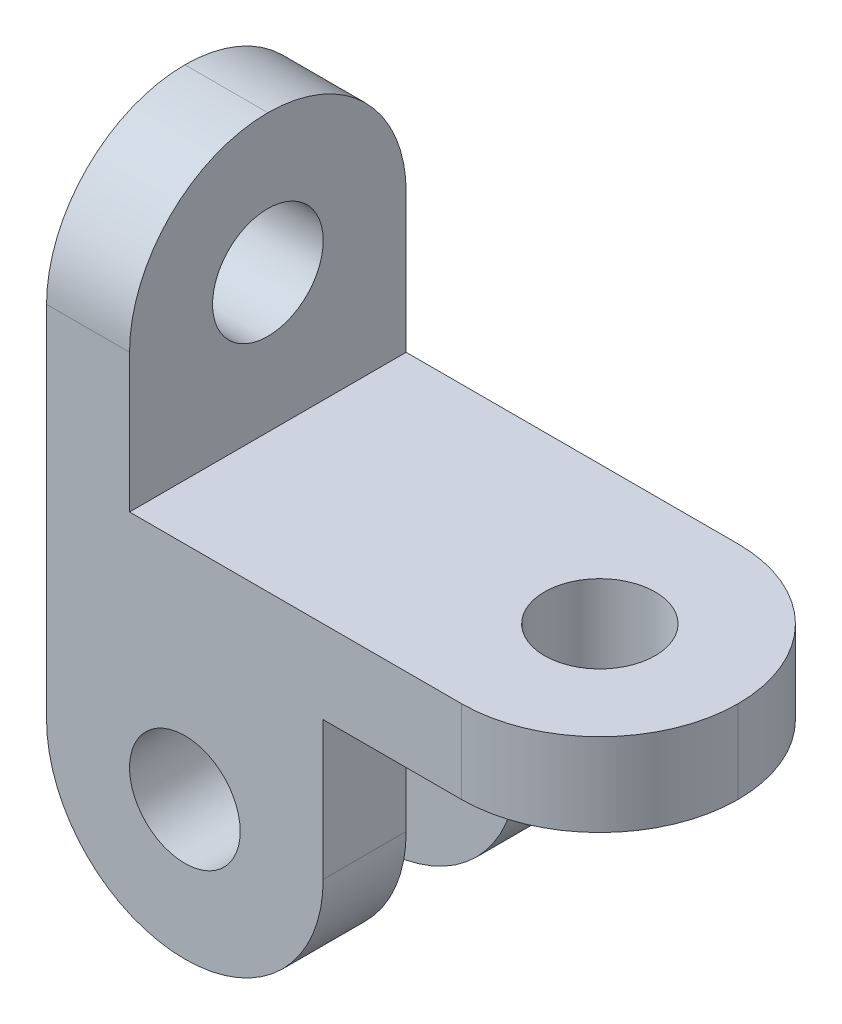
ISO-10303-21;
HEADER;
FILE_DESCRIPTION(('STEP AP214'),'2;1');
FILE_NAME('part.step','',(''),(''),'','','');
FILE_SCHEMA(('AUTOMOTIVE_DESIGN { 1 0 10303 214 1 1 1 1 }'));
ENDSEC;
DATA;
#1=APPLICATION_CONTEXT('core data for automotive mechanical design processes');
#2=APPLICATION_PROTOCOL_DEFINITION('international standard','automotive_design',2000,#1);
#3=PRODUCT_CONTEXT('',#1,'mechanical');
#4=PRODUCT('Part','Part','',(#3));
#5=PRODUCT_RELATED_PRODUCT_CATEGORY('part','',(#4));
#6=PRODUCT_DEFINITION_FORMATION('','',#4);
#7=PRODUCT_DEFINITION_CONTEXT('part definition',#1,'design');
#8=PRODUCT_DEFINITION('design','',#6,#7);
#9=PRODUCT_DEFINITION_SHAPE('','',#8);
#10=(LENGTH_UNIT() NAMED_UNIT(*) SI_UNIT(.MILLI.,.METRE.));
#11=(NAMED_UNIT(*) PLANE_ANGLE_UNIT() SI_UNIT($,.RADIAN.));
#12=(NAMED_UNIT(*) SI_UNIT($,.STERADIAN.) SOLID_ANGLE_UNIT());
#13=UNCERTAINTY_MEASURE_WITH_UNIT(LENGTH_MEASURE(1.E-05),#10,'distance_accuracy_value','');
#14=(GEOMETRIC_REPRESENTATION_CONTEXT(3) GLOBAL_UNCERTAINTY_ASSIGNED_CONTEXT((#13)) GLOBAL_UNIT_ASSIGNED_CONTEXT((#10,
#11,#12)) REPRESENTATION_CONTEXT('',''));
#15=CARTESIAN_POINT('',(0.,0.,0.));
#16=DIRECTION('',(0.,0.,1.));
#17=DIRECTION('',(1.,0.,0.));
#18=AXIS2_PLACEMENT_3D('',#15,#16,#17);
#19=CARTESIAN_POINT('',(0.,0.,0.));
#20=DIRECTION('',(0.,1.,0.));
#21=DIRECTION('',(0.,0.,1.));
#22=AXIS2_PLACEMENT_3D('',#19,#20,#21);
#23=PLANE('',#22);
#24=CARTESIAN_POINT('',(25.7142857142857,0.,3.31428571428571));
#25=DIRECTION('',(0.,1.,0.));
#26=DIRECTION('',(0.,0.,1.));
#27=AXIS2_PLACEMENT_3D('',#24,#25,#26);
#28=CIRCLE('',#27,8.);
#29=CARTESIAN_POINT('',(25.7142857142857,0.,11.3142857142857));
#30=VERTEX_POINT('',#29);
#31=EDGE_CURVE('E284',#30,#30,#28,.T.);
#32=ORIENTED_EDGE('',*,*,#31,.T.);
#33=EDGE_LOOP('',(#32));
#34=FACE_BOUND('',#33,.T.);
#35=DIRECTION('',(-1.,0.,0.));
#36=VECTOR('',#35,1.);
#37=CARTESIAN_POINT('',(-34.2857142857143,0.,-16.6857142857143));
#38=LINE('',#37,#36);
#39=CARTESIAN_POINT('',(25.7142857142857,0.,-16.6857142857143));
#40=VERTEX_POINT('',#39);
#41=CARTESIAN_POINT('',(5.71428571428571,0.,-16.6857142857143));
#42=VERTEX_POINT('',#41);
#43=EDGE_CURVE('E167',#40,#42,#38,.T.);
#44=ORIENTED_EDGE('',*,*,#43,.F.);
#45=CARTESIAN_POINT('',(25.7142857142857,0.,3.31428571428571));
#46=DIRECTION('',(0.,1.,0.));
#47=DIRECTION('',(0.,0.,1.));
#48=AXIS2_PLACEMENT_3D('',#45,#46,#47);
#49=CIRCLE('',#48,20.);
#50=CARTESIAN_POINT('',(45.7142857142857,0.,3.31428571428571));
#51=VERTEX_POINT('',#50);
#52=EDGE_CURVE('E264',#40,#51,#49,.F.);
#53=ORIENTED_EDGE('',*,*,#52,.T.);
#54=CARTESIAN_POINT('',(25.7142857142857,0.,3.31428571428571));
#55=DIRECTION('',(0.,1.,0.));
#56=DIRECTION('',(0.,0.,1.));
#57=AXIS2_PLACEMENT_3D('',#54,#55,#56);
#58=CIRCLE('',#57,20.);
#59=CARTESIAN_POINT('',(25.7142857142857,0.,23.3142857142857));
#60=VERTEX_POINT('',#59);
#61=EDGE_CURVE('E262',#51,#60,#58,.F.);
#62=ORIENTED_EDGE('',*,*,#61,.T.);
#63=DIRECTION('',(1.,0.,0.));
#64=VECTOR('',#63,1.);
#65=CARTESIAN_POINT('',(-34.2857142857143,0.,23.3142857142857));
#66=LINE('',#65,#64);
#67=CARTESIAN_POINT('',(5.71428571428572,0.,23.3142857142857));
#68=VERTEX_POINT('',#67);
#69=EDGE_CURVE('E174',#68,#60,#66,.T.);
#70=ORIENTED_EDGE('',*,*,#69,.F.);
#71=DIRECTION('',(0.,0.,1.));
#72=VECTOR('',#71,1.);
#73=CARTESIAN_POINT('',(5.71428571428572,0.,23.3142857142857));
#74=LINE('',#73,#72);
#75=CARTESIAN_POINT('',(5.71428571428572,0.,11.3142857142857));
#76=VERTEX_POINT('',#75);
#77=EDGE_CURVE('E194',#76,#68,#74,.T.);
#78=ORIENTED_EDGE('',*,*,#77,.F.);
#79=DIRECTION('',(1.,0.,0.));
#80=VECTOR('',#79,1.);
#81=CARTESIAN_POINT('',(-34.2857142857143,0.,11.3142857142857));
#82=LINE('',#81,#80);
#83=CARTESIAN_POINT('',(-34.2857142857143,0.,11.3142857142857));
#84=VERTEX_POINT('',#83);
#85=EDGE_CURVE('E162',#84,#76,#82,.T.);
#86=ORIENTED_EDGE('',*,*,#85,.F.);
#87=DIRECTION('',(0.,0.,1.));
#88=VECTOR('',#87,1.);
#89=CARTESIAN_POINT('',(-34.2857142857143,0.,-16.6857142857143));
#90=LINE('',#89,#88);
#91=CARTESIAN_POINT('',(-34.2857142857143,0.,-4.68571428571429));
#92=VERTEX_POINT('',#91);
#93=EDGE_CURVE('E211',#92,#84,#90,.T.);
#94=ORIENTED_EDGE('',*,*,#93,.F.);
#95=DIRECTION('',(-1.,0.,0.));
#96=VECTOR('',#95,1.);
#97=CARTESIAN_POINT('',(-34.2857142857143,0.,-4.68571428571429));
#98=LINE('',#97,#96);
#99=CARTESIAN_POINT('',(5.71428571428571,0.,-4.68571428571429));
#100=VERTEX_POINT('',#99);
#101=EDGE_CURVE('E178',#100,#92,#98,.T.);
#102=ORIENTED_EDGE('',*,*,#101,.F.);
#103=DIRECTION('',(0.,0.,1.));
#104=VECTOR('',#103,1.);
#105=CARTESIAN_POINT('',(5.71428571428571,0.,-16.6857142857143));
#106=LINE('',#105,#104);
#107=EDGE_CURVE('E156',#42,#100,#106,.T.);
#108=ORIENTED_EDGE('',*,*,#107,.F.);
#109=EDGE_LOOP('',(#44,#53,#62,#70,#78,#86,#94,#102,#108));
#110=FACE_BOUND('',#109,.T.);
#111=ADVANCED_FACE('F37',(#34,#110),#23,.F.);
#112=CARTESIAN_POINT('',(-34.2857142857143,12.,-16.6857142857143));
#113=DIRECTION('',(1.,0.,0.));
#114=DIRECTION('',(0.,0.,-1.));
#115=AXIS2_PLACEMENT_3D('',#112,#113,#114);
#116=PLANE('',#115);
#117=CARTESIAN_POINT('',(-34.2857142857143,32.,3.31428571428572));
#118=DIRECTION('',(1.,0.,0.));
#119=DIRECTION('',(0.,0.,-1.));
#120=AXIS2_PLACEMENT_3D('',#117,#118,#119);
#121=CIRCLE('',#120,8.);
#122=CARTESIAN_POINT('',(-34.2857142857143,32.,-4.68571428571429));
#123=VERTEX_POINT('',#122);
#124=EDGE_CURVE('E276',#123,#123,#121,.T.);
#125=ORIENTED_EDGE('',*,*,#124,.T.);
#126=EDGE_LOOP('',(#125));
#127=FACE_BOUND('',#126,.T.);
#128=DIRECTION('',(0.,-1.,0.));
#129=VECTOR('',#128,1.);
#130=CARTESIAN_POINT('',(-34.2857142857143,12.,-16.6857142857143));
#131=LINE('',#130,#129);
#132=CARTESIAN_POINT('',(-34.2857142857143,32.,-16.6857142857143));
#133=VERTEX_POINT('',#132);
#134=CARTESIAN_POINT('',(-34.2857142857143,-20.,-16.6857142857143));
#135=VERTEX_POINT('',#134);
#136=EDGE_CURVE('E215',#133,#135,#131,.T.);
#137=ORIENTED_EDGE('',*,*,#136,.T.);
#138=DIRECTION('',(0.,0.,-1.));
#139=VECTOR('',#138,1.);
#140=CARTESIAN_POINT('',(-34.2857142857143,-20.,-16.6857142857143));
#141=LINE('',#140,#139);
#142=CARTESIAN_POINT('',(-34.2857142857143,-20.,-4.68571428571429));
#143=VERTEX_POINT('',#142);
#144=EDGE_CURVE('E240',#135,#143,#141,.F.);
#145=ORIENTED_EDGE('',*,*,#144,.T.);
#146=DIRECTION('',(0.,1.,0.));
#147=VECTOR('',#146,1.);
#148=CARTESIAN_POINT('',(-34.2857142857143,-40.,-4.68571428571429));
#149=LINE('',#148,#147);
#150=EDGE_CURVE('E181',#143,#92,#149,.T.);
#151=ORIENTED_EDGE('',*,*,#150,.T.);
#152=ORIENTED_EDGE('',*,*,#93,.T.);
#153=DIRECTION('',(0.,1.,0.));
#154=VECTOR('',#153,1.);
#155=CARTESIAN_POINT('',(-34.2857142857143,-40.,11.3142857142857));
#156=LINE('',#155,#154);
#157=CARTESIAN_POINT('',(-34.2857142857143,-20.,11.3142857142857));
#158=VERTEX_POINT('',#157);
#159=EDGE_CURVE('E201',#158,#84,#156,.T.);
#160=ORIENTED_EDGE('',*,*,#159,.F.);
#161=DIRECTION('',(0.,0.,-1.));
#162=VECTOR('',#161,1.);
#163=CARTESIAN_POINT('',(-34.2857142857143,-20.,23.3142857142857));
#164=LINE('',#163,#162);
#165=CARTESIAN_POINT('',(-34.2857142857143,-20.,23.3142857142857));
#166=VERTEX_POINT('',#165);
#167=EDGE_CURVE('E237',#158,#166,#164,.F.);
#168=ORIENTED_EDGE('',*,*,#167,.T.);
#169=DIRECTION('',(0.,-1.,0.));
#170=VECTOR('',#169,1.);
#171=CARTESIAN_POINT('',(-34.2857142857143,12.,23.3142857142857));
#172=LINE('',#171,#170);
#173=CARTESIAN_POINT('',(-34.2857142857143,32.,23.3142857142857));
#174=VERTEX_POINT('',#173);
#175=EDGE_CURVE('E222',#174,#166,#172,.T.);
#176=ORIENTED_EDGE('',*,*,#175,.F.);
#177=CARTESIAN_POINT('',(-34.2857142857143,32.,3.31428571428571));
#178=DIRECTION('',(1.,0.,0.));
#179=DIRECTION('',(0.,0.,-1.));
#180=AXIS2_PLACEMENT_3D('',#177,#178,#179);
#181=CIRCLE('',#180,20.);
#182=CARTESIAN_POINT('',(-34.2857142857143,52.,3.31428571428571));
#183=VERTEX_POINT('',#182);
#184=EDGE_CURVE('E233',#174,#183,#181,.F.);
#185=ORIENTED_EDGE('',*,*,#184,.T.);
#186=CARTESIAN_POINT('',(-34.2857142857143,32.,3.31428571428571));
#187=DIRECTION('',(1.,0.,0.));
#188=DIRECTION('',(0.,0.,-1.));
#189=AXIS2_PLACEMENT_3D('',#186,#187,#188);
#190=CIRCLE('',#189,20.);
#191=EDGE_CURVE('E235',#183,#133,#190,.F.);
#192=ORIENTED_EDGE('',*,*,#191,.T.);
#193=EDGE_LOOP('',(#137,#145,#151,#152,#160,#168,#176,#185,#192));
#194=FACE_BOUND('',#193,.T.);
#195=ADVANCED_FACE('F322',(#127,#194),#116,.F.);
#196=CARTESIAN_POINT('',(-34.2857142857143,12.,23.3142857142857));
#197=DIRECTION('',(0.,0.,-1.));
#198=DIRECTION('',(-1.,0.,0.));
#199=AXIS2_PLACEMENT_3D('',#196,#197,#198);
#200=PLANE('',#199);
#201=CARTESIAN_POINT('',(-14.2857142857143,-20.,23.3142857142857));
#202=DIRECTION('',(0.,0.,1.));
#203=DIRECTION('',(1.,0.,0.));
#204=AXIS2_PLACEMENT_3D('',#201,#202,#203);
#205=CIRCLE('',#204,8.);
#206=CARTESIAN_POINT('',(-6.28571428571428,-20.,23.3142857142857));
#207=VERTEX_POINT('',#206);
#208=EDGE_CURVE('E294',#207,#207,#205,.T.);
#209=ORIENTED_EDGE('',*,*,#208,.F.);
#210=EDGE_LOOP('',(#209));
#211=FACE_BOUND('',#210,.T.);
#212=ORIENTED_EDGE('',*,*,#175,.T.);
#213=CARTESIAN_POINT('',(-14.2857142857143,-20.,23.3142857142857));
#214=DIRECTION('',(0.,0.,-1.));
#215=DIRECTION('',(-1.,0.,0.));
#216=AXIS2_PLACEMENT_3D('',#213,#214,#215);
#217=CIRCLE('',#216,20.);
#218=CARTESIAN_POINT('',(-14.2857142857143,-40.,23.3142857142857));
#219=VERTEX_POINT('',#218);
#220=EDGE_CURVE('E257',#166,#219,#217,.F.);
#221=ORIENTED_EDGE('',*,*,#220,.T.);
#222=CARTESIAN_POINT('',(-14.2857142857143,-20.,23.3142857142857));
#223=DIRECTION('',(0.,0.,-1.));
#224=DIRECTION('',(-1.,0.,0.));
#225=AXIS2_PLACEMENT_3D('',#222,#223,#224);
#226=CIRCLE('',#225,20.);
#227=CARTESIAN_POINT('',(5.71428571428572,-20.,23.3142857142857));
#228=VERTEX_POINT('',#227);
#229=EDGE_CURVE('E255',#219,#228,#226,.F.);
#230=ORIENTED_EDGE('',*,*,#229,.T.);
#231=DIRECTION('',(0.,1.,0.));
#232=VECTOR('',#231,1.);
#233=CARTESIAN_POINT('',(5.71428571428572,-40.,23.3142857142857));
#234=LINE('',#233,#232);
#235=EDGE_CURVE('E197',#228,#68,#234,.T.);
#236=ORIENTED_EDGE('',*,*,#235,.T.);
#237=ORIENTED_EDGE('',*,*,#69,.T.);
#238=DIRECTION('',(0.,-1.,0.));
#239=VECTOR('',#238,1.);
#240=CARTESIAN_POINT('',(25.7142857142857,12.,23.3142857142857));
#241=LINE('',#240,#239);
#242=CARTESIAN_POINT('',(25.7142857142857,12.,23.3142857142857));
#243=VERTEX_POINT('',#242);
#244=EDGE_CURVE('E253',#60,#243,#241,.F.);
#245=ORIENTED_EDGE('',*,*,#244,.T.);
#246=DIRECTION('',(1.,0.,0.));
#247=VECTOR('',#246,1.);
#248=CARTESIAN_POINT('',(-34.2857142857143,12.,23.3142857142857));
#249=LINE('',#248,#247);
#250=CARTESIAN_POINT('',(-22.2857142857143,12.,23.3142857142857));
#251=VERTEX_POINT('',#250);
#252=EDGE_CURVE('E173',#251,#243,#249,.T.);
#253=ORIENTED_EDGE('',*,*,#252,.F.);
#254=DIRECTION('',(0.,-1.,0.));
#255=VECTOR('',#254,1.);
#256=CARTESIAN_POINT('',(-22.2857142857143,52.,23.3142857142857));
#257=LINE('',#256,#255);
#258=CARTESIAN_POINT('',(-22.2857142857143,32.,23.3142857142857));
#259=VERTEX_POINT('',#258);
#260=EDGE_CURVE('E209',#259,#251,#257,.T.);
#261=ORIENTED_EDGE('',*,*,#260,.F.);
#262=DIRECTION('',(1.,0.,0.));
#263=VECTOR('',#262,1.);
#264=CARTESIAN_POINT('',(-34.2857142857143,32.,23.3142857142857));
#265=LINE('',#264,#263);
#266=EDGE_CURVE('E251',#259,#174,#265,.F.);
#267=ORIENTED_EDGE('',*,*,#266,.T.);
#268=EDGE_LOOP('',(#212,#221,#230,#236,#237,#245,#253,#261,#267));
#269=FACE_BOUND('',#268,.T.);
#270=ADVANCED_FACE('F328',(#211,#269),#200,.F.);
#271=CARTESIAN_POINT('',(-34.2857142857143,12.,-16.6857142857143));
#272=DIRECTION('',(0.,0.,1.));
#273=DIRECTION('',(1.,0.,0.));
#274=AXIS2_PLACEMENT_3D('',#271,#272,#273);
#275=PLANE('',#274);
#276=CARTESIAN_POINT('',(-14.2857142857143,-20.,-16.6857142857143));
#277=DIRECTION('',(0.,0.,1.));
#278=DIRECTION('',(1.,0.,0.));
#279=AXIS2_PLACEMENT_3D('',#276,#277,#278);
#280=CIRCLE('',#279,8.);
#281=CARTESIAN_POINT('',(-6.28571428571428,-20.,-16.6857142857143));
#282=VERTEX_POINT('',#281);
#283=EDGE_CURVE('E297',#282,#282,#280,.T.);
#284=ORIENTED_EDGE('',*,*,#283,.T.);
#285=EDGE_LOOP('',(#284));
#286=FACE_BOUND('',#285,.T.);
#287=CARTESIAN_POINT('',(-14.2857142857143,-20.,-16.6857142857143));
#288=DIRECTION('',(0.,0.,1.));
#289=DIRECTION('',(1.,0.,0.));
#290=AXIS2_PLACEMENT_3D('',#287,#288,#289);
#291=CIRCLE('',#290,20.);
#292=CARTESIAN_POINT('',(5.71428571428571,-20.,-16.6857142857143));
#293=VERTEX_POINT('',#292);
#294=CARTESIAN_POINT('',(-14.2857142857143,-40.,-16.6857142857143));
#295=VERTEX_POINT('',#294);
#296=EDGE_CURVE('E229',#293,#295,#291,.F.);
#297=ORIENTED_EDGE('',*,*,#296,.T.);
#298=CARTESIAN_POINT('',(-14.2857142857143,-20.,-16.6857142857143));
#299=DIRECTION('',(0.,0.,1.));
#300=DIRECTION('',(1.,0.,0.));
#301=AXIS2_PLACEMENT_3D('',#298,#299,#300);
#302=CIRCLE('',#301,20.);
#303=EDGE_CURVE('E231',#295,#135,#302,.F.);
#304=ORIENTED_EDGE('',*,*,#303,.T.);
#305=ORIENTED_EDGE('',*,*,#136,.F.);
#306=DIRECTION('',(-1.,0.,0.));
#307=VECTOR('',#306,1.);
#308=CARTESIAN_POINT('',(-22.2857142857143,32.,-16.6857142857143));
#309=LINE('',#308,#307);
#310=CARTESIAN_POINT('',(-22.2857142857143,32.,-16.6857142857143));
#311=VERTEX_POINT('',#310);
#312=EDGE_CURVE('E225',#133,#311,#309,.F.);
#313=ORIENTED_EDGE('',*,*,#312,.T.);
#314=DIRECTION('',(0.,-1.,0.));
#315=VECTOR('',#314,1.);
#316=CARTESIAN_POINT('',(-22.2857142857143,52.,-16.6857142857143));
#317=LINE('',#316,#315);
#318=CARTESIAN_POINT('',(-22.2857142857143,12.,-16.6857142857143));
#319=VERTEX_POINT('',#318);
#320=EDGE_CURVE('E206',#311,#319,#317,.T.);
#321=ORIENTED_EDGE('',*,*,#320,.T.);
#322=DIRECTION('',(-1.,0.,0.));
#323=VECTOR('',#322,1.);
#324=CARTESIAN_POINT('',(-34.2857142857143,12.,-16.6857142857143));
#325=LINE('',#324,#323);
#326=CARTESIAN_POINT('',(25.7142857142857,12.,-16.6857142857143));
#327=VERTEX_POINT('',#326);
#328=EDGE_CURVE('E213',#327,#319,#325,.T.);
#329=ORIENTED_EDGE('',*,*,#328,.F.);
#330=DIRECTION('',(0.,-1.,0.));
#331=VECTOR('',#330,1.);
#332=CARTESIAN_POINT('',(25.7142857142857,12.,-16.6857142857143));
#333=LINE('',#332,#331);
#334=EDGE_CURVE('E171',#327,#40,#333,.T.);
#335=ORIENTED_EDGE('',*,*,#334,.T.);
#336=ORIENTED_EDGE('',*,*,#43,.T.);
#337=DIRECTION('',(0.,1.,0.));
#338=VECTOR('',#337,1.);
#339=CARTESIAN_POINT('',(5.71428571428571,-40.,-16.6857142857143));
#340=LINE('',#339,#338);
#341=EDGE_CURVE('E151',#293,#42,#340,.T.);
#342=ORIENTED_EDGE('',*,*,#341,.F.);
#343=EDGE_LOOP('',(#297,#304,#305,#313,#321,#329,#335,#336,#342));
#344=FACE_BOUND('',#343,.T.);
#345=ADVANCED_FACE('F168',(#286,#344),#275,.F.);
#346=CARTESIAN_POINT('',(0.,12.,0.));
#347=DIRECTION('',(0.,1.,0.));
#348=DIRECTION('',(0.,0.,1.));
#349=AXIS2_PLACEMENT_3D('',#346,#347,#348);
#350=PLANE('',#349);
#351=CARTESIAN_POINT('',(25.7142857142857,12.,3.31428571428571));
#352=DIRECTION('',(0.,1.,0.));
#353=DIRECTION('',(0.,0.,1.));
#354=AXIS2_PLACEMENT_3D('',#351,#352,#353);
#355=CIRCLE('',#354,8.);
#356=CARTESIAN_POINT('',(25.7142857142857,12.,11.3142857142857));
#357=VERTEX_POINT('',#356);
#358=EDGE_CURVE('E286',#357,#357,#355,.T.);
#359=ORIENTED_EDGE('',*,*,#358,.F.);
#360=EDGE_LOOP('',(#359));
#361=FACE_BOUND('',#360,.T.);
#362=CARTESIAN_POINT('',(25.7142857142857,12.,3.31428571428571));
#363=DIRECTION('',(0.,1.,0.));
#364=DIRECTION('',(0.,0.,1.));
#365=AXIS2_PLACEMENT_3D('',#362,#363,#364);
#366=CIRCLE('',#365,20.);
#367=CARTESIAN_POINT('',(45.7142857142857,12.,3.31428571428571));
#368=VERTEX_POINT('',#367);
#369=EDGE_CURVE('E60',#243,#368,#366,.T.);
#370=ORIENTED_EDGE('',*,*,#369,.T.);
#371=CARTESIAN_POINT('',(25.7142857142857,12.,3.31428571428571));
#372=DIRECTION('',(0.,1.,0.));
#373=DIRECTION('',(0.,0.,1.));
#374=AXIS2_PLACEMENT_3D('',#371,#372,#373);
#375=CIRCLE('',#374,20.);
#376=EDGE_CURVE('E267',#368,#327,#375,.T.);
#377=ORIENTED_EDGE('',*,*,#376,.T.);
#378=ORIENTED_EDGE('',*,*,#328,.T.);
#379=DIRECTION('',(0.,0.,-1.));
#380=VECTOR('',#379,1.);
#381=CARTESIAN_POINT('',(-22.2857142857143,12.,-16.6857142857143));
#382=LINE('',#381,#380);
#383=EDGE_CURVE('E203',#251,#319,#382,.T.);
#384=ORIENTED_EDGE('',*,*,#383,.F.);
#385=ORIENTED_EDGE('',*,*,#252,.T.);
#386=EDGE_LOOP('',(#370,#377,#378,#384,#385));
#387=FACE_BOUND('',#386,.T.);
#388=ADVANCED_FACE('F332',(#361,#387),#350,.T.);
#389=CARTESIAN_POINT('',(-22.2857142857143,52.,-16.6857142857143));
#390=DIRECTION('',(-1.,0.,0.));
#391=DIRECTION('',(0.,0.,1.));
#392=AXIS2_PLACEMENT_3D('',#389,#390,#391);
#393=PLANE('',#392);
#394=CARTESIAN_POINT('',(-22.2857142857143,32.,3.31428571428571));
#395=DIRECTION('',(1.,0.,0.));
#396=DIRECTION('',(0.,0.,-1.));
#397=AXIS2_PLACEMENT_3D('',#394,#395,#396);
#398=CIRCLE('',#397,8.);
#399=CARTESIAN_POINT('',(-22.2857142857143,32.,-4.68571428571429));
#400=VERTEX_POINT('',#399);
#401=EDGE_CURVE('E187',#400,#400,#398,.T.);
#402=ORIENTED_EDGE('',*,*,#401,.F.);
#403=EDGE_LOOP('',(#402));
#404=FACE_BOUND('',#403,.T.);
#405=ORIENTED_EDGE('',*,*,#320,.F.);
#406=CARTESIAN_POINT('',(-22.2857142857143,32.,3.31428571428571));
#407=DIRECTION('',(-1.,0.,0.));
#408=DIRECTION('',(0.,0.,1.));
#409=AXIS2_PLACEMENT_3D('',#406,#407,#408);
#410=CIRCLE('',#409,20.);
#411=CARTESIAN_POINT('',(-22.2857142857143,52.,3.31428571428571));
#412=VERTEX_POINT('',#411);
#413=EDGE_CURVE('E11',#311,#412,#410,.F.);
#414=ORIENTED_EDGE('',*,*,#413,.T.);
#415=CARTESIAN_POINT('',(-22.2857142857143,32.,3.31428571428571));
#416=DIRECTION('',(-1.,0.,0.));
#417=DIRECTION('',(0.,0.,1.));
#418=AXIS2_PLACEMENT_3D('',#415,#416,#417);
#419=CIRCLE('',#418,20.);
#420=EDGE_CURVE('E46',#412,#259,#419,.F.);
#421=ORIENTED_EDGE('',*,*,#420,.T.);
#422=ORIENTED_EDGE('',*,*,#260,.T.);
#423=ORIENTED_EDGE('',*,*,#383,.T.);
#424=EDGE_LOOP('',(#405,#414,#421,#422,#423));
#425=FACE_BOUND('',#424,.T.);
#426=ADVANCED_FACE('F373',(#404,#425),#393,.F.);
#427=CARTESIAN_POINT('',(-34.2857142857143,-40.,11.3142857142857));
#428=DIRECTION('',(0.,0.,1.));
#429=DIRECTION('',(1.,0.,0.));
#430=AXIS2_PLACEMENT_3D('',#427,#428,#429);
#431=PLANE('',#430);
#432=CARTESIAN_POINT('',(-14.2857142857143,-20.,11.3142857142857));
#433=DIRECTION('',(0.,0.,1.));
#434=DIRECTION('',(1.,0.,0.));
#435=AXIS2_PLACEMENT_3D('',#432,#433,#434);
#436=CIRCLE('',#435,8.);
#437=CARTESIAN_POINT('',(-6.28571428571428,-20.,11.3142857142857));
#438=VERTEX_POINT('',#437);
#439=EDGE_CURVE('E289',#438,#438,#436,.T.);
#440=ORIENTED_EDGE('',*,*,#439,.T.);
#441=EDGE_LOOP('',(#440));
#442=FACE_BOUND('',#441,.T.);
#443=CARTESIAN_POINT('',(-14.2857142857143,-20.,11.3142857142857));
#444=DIRECTION('',(0.,0.,1.));
#445=DIRECTION('',(1.,0.,0.));
#446=AXIS2_PLACEMENT_3D('',#443,#444,#445);
#447=CIRCLE('',#446,20.);
#448=CARTESIAN_POINT('',(5.71428571428572,-20.,11.3142857142857));
#449=VERTEX_POINT('',#448);
#450=CARTESIAN_POINT('',(-14.2857142857143,-40.,11.3142857142857));
#451=VERTEX_POINT('',#450);
#452=EDGE_CURVE('E247',#449,#451,#447,.F.);
#453=ORIENTED_EDGE('',*,*,#452,.T.);
#454=CARTESIAN_POINT('',(-14.2857142857143,-20.,11.3142857142857));
#455=DIRECTION('',(0.,0.,1.));
#456=DIRECTION('',(1.,0.,0.));
#457=AXIS2_PLACEMENT_3D('',#454,#455,#456);
#458=CIRCLE('',#457,20.);
#459=EDGE_CURVE('E249',#451,#158,#458,.F.);
#460=ORIENTED_EDGE('',*,*,#459,.T.);
#461=ORIENTED_EDGE('',*,*,#159,.T.);
#462=ORIENTED_EDGE('',*,*,#85,.T.);
#463=DIRECTION('',(0.,1.,0.));
#464=VECTOR('',#463,1.);
#465=CARTESIAN_POINT('',(5.71428571428572,-40.,11.3142857142857));
#466=LINE('',#465,#464);
#467=EDGE_CURVE('E199',#449,#76,#466,.T.);
#468=ORIENTED_EDGE('',*,*,#467,.F.);
#469=EDGE_LOOP('',(#453,#460,#461,#462,#468));
#470=FACE_BOUND('',#469,.T.);
#471=ADVANCED_FACE('F392',(#442,#470),#431,.F.);
#472=CARTESIAN_POINT('',(5.71428571428572,-40.,23.3142857142857));
#473=DIRECTION('',(-1.,0.,0.));
#474=DIRECTION('',(0.,0.,1.));
#475=AXIS2_PLACEMENT_3D('',#472,#473,#474);
#476=PLANE('',#475);
#477=ORIENTED_EDGE('',*,*,#235,.F.);
#478=DIRECTION('',(0.,0.,1.));
#479=VECTOR('',#478,1.);
#480=CARTESIAN_POINT('',(5.71428571428572,-20.,11.3142857142857));
#481=LINE('',#480,#479);
#482=EDGE_CURVE('E260',#228,#449,#481,.F.);
#483=ORIENTED_EDGE('',*,*,#482,.T.);
#484=ORIENTED_EDGE('',*,*,#467,.T.);
#485=ORIENTED_EDGE('',*,*,#77,.T.);
#486=EDGE_LOOP('',(#477,#483,#484,#485));
#487=FACE_BOUND('',#486,.T.);
#488=ADVANCED_FACE('F387',(#487),#476,.F.);
#489=CARTESIAN_POINT('',(5.71428571428571,-40.,-16.6857142857143));
#490=DIRECTION('',(-1.,0.,0.));
#491=DIRECTION('',(0.,0.,1.));
#492=AXIS2_PLACEMENT_3D('',#489,#490,#491);
#493=PLANE('',#492);
#494=DIRECTION('',(0.,1.,0.));
#495=VECTOR('',#494,1.);
#496=CARTESIAN_POINT('',(5.71428571428571,-40.,-4.68571428571429));
#497=LINE('',#496,#495);
#498=CARTESIAN_POINT('',(5.71428571428571,-20.,-4.68571428571429));
#499=VERTEX_POINT('',#498);
#500=EDGE_CURVE('E163',#499,#100,#497,.T.);
#501=ORIENTED_EDGE('',*,*,#500,.F.);
#502=DIRECTION('',(0.,0.,1.));
#503=VECTOR('',#502,1.);
#504=CARTESIAN_POINT('',(5.71428571428571,-20.,-16.6857142857143));
#505=LINE('',#504,#503);
#506=EDGE_CURVE('E159',#499,#293,#505,.F.);
#507=ORIENTED_EDGE('',*,*,#506,.T.);
#508=ORIENTED_EDGE('',*,*,#341,.T.);
#509=ORIENTED_EDGE('',*,*,#107,.T.);
#510=EDGE_LOOP('',(#501,#507,#508,#509));
#511=FACE_BOUND('',#510,.T.);
#512=ADVANCED_FACE('F154',(#511),#493,.F.);
#513=CARTESIAN_POINT('',(-34.2857142857143,-40.,-4.68571428571429));
#514=DIRECTION('',(0.,0.,-1.));
#515=DIRECTION('',(-1.,0.,0.));
#516=AXIS2_PLACEMENT_3D('',#513,#514,#515);
#517=PLANE('',#516);
#518=CARTESIAN_POINT('',(-14.2857142857143,-20.,-4.68571428571429));
#519=DIRECTION('',(0.,0.,-1.));
#520=DIRECTION('',(-1.,0.,0.));
#521=AXIS2_PLACEMENT_3D('',#518,#519,#520);
#522=CIRCLE('',#521,8.);
#523=CARTESIAN_POINT('',(-22.2857142857143,-20.,-4.68571428571429));
#524=VERTEX_POINT('',#523);
#525=EDGE_CURVE('E41',#524,#524,#522,.T.);
#526=ORIENTED_EDGE('',*,*,#525,.T.);
#527=EDGE_LOOP('',(#526));
#528=FACE_BOUND('',#527,.T.);
#529=ORIENTED_EDGE('',*,*,#150,.F.);
#530=CARTESIAN_POINT('',(-14.2857142857143,-20.,-4.68571428571429));
#531=DIRECTION('',(0.,0.,-1.));
#532=DIRECTION('',(-1.,0.,0.));
#533=AXIS2_PLACEMENT_3D('',#530,#531,#532);
#534=CIRCLE('',#533,20.);
#535=CARTESIAN_POINT('',(-14.2857142857143,-40.,-4.68571428571429));
#536=VERTEX_POINT('',#535);
#537=EDGE_CURVE('E245',#143,#536,#534,.F.);
#538=ORIENTED_EDGE('',*,*,#537,.T.);
#539=CARTESIAN_POINT('',(-14.2857142857143,-20.,-4.68571428571429));
#540=DIRECTION('',(0.,0.,-1.));
#541=DIRECTION('',(-1.,0.,0.));
#542=AXIS2_PLACEMENT_3D('',#539,#540,#541);
#543=CIRCLE('',#542,20.);
#544=EDGE_CURVE('E243',#536,#499,#543,.F.);
#545=ORIENTED_EDGE('',*,*,#544,.T.);
#546=ORIENTED_EDGE('',*,*,#500,.T.);
#547=ORIENTED_EDGE('',*,*,#101,.T.);
#548=EDGE_LOOP('',(#529,#538,#545,#546,#547));
#549=FACE_BOUND('',#548,.T.);
#550=ADVANCED_FACE('F304',(#528,#549),#517,.F.);
#551=CARTESIAN_POINT('',(-14.2857142857143,-20.,0.));
#552=DIRECTION('',(0.,0.,1.));
#553=DIRECTION('',(1.,0.,0.));
#554=AXIS2_PLACEMENT_3D('',#551,#552,#553);
#555=CYLINDRICAL_SURFACE('',#554,20.);
#556=ORIENTED_EDGE('',*,*,#506,.F.);
#557=ORIENTED_EDGE('',*,*,#544,.F.);
#558=DIRECTION('',(0.,0.,1.));
#559=VECTOR('',#558,1.);
#560=CARTESIAN_POINT('',(-14.2857142857143,-40.,0.));
#561=LINE('',#560,#559);
#562=EDGE_CURVE('E179',#295,#536,#561,.T.);
#563=ORIENTED_EDGE('',*,*,#562,.F.);
#564=ORIENTED_EDGE('',*,*,#296,.F.);
#565=EDGE_LOOP('',(#556,#557,#563,#564));
#566=FACE_BOUND('',#565,.T.);
#567=ADVANCED_FACE('F343',(#566),#555,.T.);
#568=CARTESIAN_POINT('',(-14.2857142857143,-20.,0.));
#569=DIRECTION('',(0.,0.,-1.));
#570=DIRECTION('',(-1.,0.,0.));
#571=AXIS2_PLACEMENT_3D('',#568,#569,#570);
#572=CYLINDRICAL_SURFACE('',#571,20.);
#573=ORIENTED_EDGE('',*,*,#537,.F.);
#574=ORIENTED_EDGE('',*,*,#144,.F.);
#575=ORIENTED_EDGE('',*,*,#303,.F.);
#576=ORIENTED_EDGE('',*,*,#562,.T.);
#577=EDGE_LOOP('',(#573,#574,#575,#576));
#578=FACE_BOUND('',#577,.T.);
#579=ADVANCED_FACE('F339',(#578),#572,.T.);
#580=CARTESIAN_POINT('',(-14.2857142857143,-20.,0.));
#581=DIRECTION('',(0.,0.,-1.));
#582=DIRECTION('',(-1.,0.,0.));
#583=AXIS2_PLACEMENT_3D('',#580,#581,#582);
#584=CYLINDRICAL_SURFACE('',#583,20.);
#585=ORIENTED_EDGE('',*,*,#482,.F.);
#586=ORIENTED_EDGE('',*,*,#229,.F.);
#587=DIRECTION('',(0.,0.,1.));
#588=VECTOR('',#587,1.);
#589=CARTESIAN_POINT('',(-14.2857142857143,-40.,23.3142857142857));
#590=LINE('',#589,#588);
#591=EDGE_CURVE('E184',#451,#219,#590,.T.);
#592=ORIENTED_EDGE('',*,*,#591,.F.);
#593=ORIENTED_EDGE('',*,*,#452,.F.);
#594=EDGE_LOOP('',(#585,#586,#592,#593));
#595=FACE_BOUND('',#594,.T.);
#596=ADVANCED_FACE('F342',(#595),#584,.T.);
#597=CARTESIAN_POINT('',(-14.2857142857143,-20.,0.));
#598=DIRECTION('',(0.,0.,1.));
#599=DIRECTION('',(1.,0.,0.));
#600=AXIS2_PLACEMENT_3D('',#597,#598,#599);
#601=CYLINDRICAL_SURFACE('',#600,20.);
#602=ORIENTED_EDGE('',*,*,#220,.F.);
#603=ORIENTED_EDGE('',*,*,#167,.F.);
#604=ORIENTED_EDGE('',*,*,#459,.F.);
#605=ORIENTED_EDGE('',*,*,#591,.T.);
#606=EDGE_LOOP('',(#602,#603,#604,#605));
#607=FACE_BOUND('',#606,.T.);
#608=ADVANCED_FACE('F348',(#607),#601,.T.);
#609=CARTESIAN_POINT('',(25.7142857142857,12.,3.31428571428571));
#610=DIRECTION('',(0.,-1.,0.));
#611=DIRECTION('',(0.,0.,-1.));
#612=AXIS2_PLACEMENT_3D('',#609,#610,#611);
#613=CYLINDRICAL_SURFACE('',#612,20.);
#614=DIRECTION('',(0.,-1.,0.));
#615=VECTOR('',#614,1.);
#616=CARTESIAN_POINT('',(45.7142857142857,12.,3.31428571428571));
#617=LINE('',#616,#615);
#618=EDGE_CURVE('E272',#368,#51,#617,.T.);
#619=ORIENTED_EDGE('',*,*,#618,.F.);
#620=ORIENTED_EDGE('',*,*,#369,.F.);
#621=ORIENTED_EDGE('',*,*,#244,.F.);
#622=ORIENTED_EDGE('',*,*,#61,.F.);
#623=EDGE_LOOP('',(#619,#620,#621,#622));
#624=FACE_BOUND('',#623,.T.);
#625=ADVANCED_FACE('F351',(#624),#613,.T.);
#626=CARTESIAN_POINT('',(25.7142857142857,12.,3.31428571428571));
#627=DIRECTION('',(0.,-1.,0.));
#628=DIRECTION('',(0.,0.,-1.));
#629=AXIS2_PLACEMENT_3D('',#626,#627,#628);
#630=CYLINDRICAL_SURFACE('',#629,20.);
#631=ORIENTED_EDGE('',*,*,#376,.F.);
#632=ORIENTED_EDGE('',*,*,#618,.T.);
#633=ORIENTED_EDGE('',*,*,#52,.F.);
#634=ORIENTED_EDGE('',*,*,#334,.F.);
#635=EDGE_LOOP('',(#631,#632,#633,#634));
#636=FACE_BOUND('',#635,.T.);
#637=ADVANCED_FACE('F356',(#636),#630,.T.);
#638=CARTESIAN_POINT('',(0.,32.,3.31428571428571));
#639=DIRECTION('',(-1.,0.,0.));
#640=DIRECTION('',(0.,0.,1.));
#641=AXIS2_PLACEMENT_3D('',#638,#639,#640);
#642=CYLINDRICAL_SURFACE('',#641,20.);
#643=ORIENTED_EDGE('',*,*,#266,.F.);
#644=ORIENTED_EDGE('',*,*,#420,.F.);
#645=DIRECTION('',(1.,0.,0.));
#646=VECTOR('',#645,1.);
#647=CARTESIAN_POINT('',(-22.2857142857143,52.,3.31428571428571));
#648=LINE('',#647,#646);
#649=EDGE_CURVE('E274',#183,#412,#648,.T.);
#650=ORIENTED_EDGE('',*,*,#649,.F.);
#651=ORIENTED_EDGE('',*,*,#184,.F.);
#652=EDGE_LOOP('',(#643,#644,#650,#651));
#653=FACE_BOUND('',#652,.T.);
#654=ADVANCED_FACE('F39',(#653),#642,.T.);
#655=CARTESIAN_POINT('',(0.,32.,3.31428571428571));
#656=DIRECTION('',(1.,0.,0.));
#657=DIRECTION('',(0.,0.,-1.));
#658=AXIS2_PLACEMENT_3D('',#655,#656,#657);
#659=CYLINDRICAL_SURFACE('',#658,20.);
#660=ORIENTED_EDGE('',*,*,#413,.F.);
#661=ORIENTED_EDGE('',*,*,#312,.F.);
#662=ORIENTED_EDGE('',*,*,#191,.F.);
#663=ORIENTED_EDGE('',*,*,#649,.T.);
#664=EDGE_LOOP('',(#660,#661,#662,#663));
#665=FACE_BOUND('',#664,.T.);
#666=ADVANCED_FACE('F362',(#665),#659,.T.);
#667=CARTESIAN_POINT('',(-34.2857142857143,32.,3.31428571428572));
#668=DIRECTION('',(1.,0.,0.));
#669=DIRECTION('',(0.,0.,-1.));
#670=AXIS2_PLACEMENT_3D('',#667,#668,#669);
#671=CYLINDRICAL_SURFACE('',#670,8.);
#672=ORIENTED_EDGE('',*,*,#124,.F.);
#673=EDGE_LOOP('',(#672));
#674=FACE_BOUND('',#673,.T.);
#675=ORIENTED_EDGE('',*,*,#401,.T.);
#676=EDGE_LOOP('',(#675));
#677=FACE_BOUND('',#676,.T.);
#678=ADVANCED_FACE('F318',(#674,#677),#671,.F.);
#679=CARTESIAN_POINT('',(25.7142857142857,0.,3.31428571428571));
#680=DIRECTION('',(0.,1.,0.));
#681=DIRECTION('',(0.,0.,1.));
#682=AXIS2_PLACEMENT_3D('',#679,#680,#681);
#683=CYLINDRICAL_SURFACE('',#682,8.);
#684=ORIENTED_EDGE('',*,*,#31,.F.);
#685=EDGE_LOOP('',(#684));
#686=FACE_BOUND('',#685,.T.);
#687=ORIENTED_EDGE('',*,*,#358,.T.);
#688=EDGE_LOOP('',(#687));
#689=FACE_BOUND('',#688,.T.);
#690=ADVANCED_FACE('F310',(#686,#689),#683,.F.);
#691=CARTESIAN_POINT('',(-14.2857142857143,-20.,-16.6857142857143));
#692=DIRECTION('',(0.,0.,1.));
#693=DIRECTION('',(1.,0.,0.));
#694=AXIS2_PLACEMENT_3D('',#691,#692,#693);
#695=CYLINDRICAL_SURFACE('',#694,8.);
#696=ORIENTED_EDGE('',*,*,#283,.F.);
#697=EDGE_LOOP('',(#696));
#698=FACE_BOUND('',#697,.T.);
#699=ORIENTED_EDGE('',*,*,#525,.F.);
#700=EDGE_LOOP('',(#699));
#701=FACE_BOUND('',#700,.T.);
#702=ADVANCED_FACE('F307',(#698,#701),#695,.F.);
#703=ORIENTED_EDGE('',*,*,#208,.T.);
#704=EDGE_LOOP('',(#703));
#705=FACE_BOUND('',#704,.T.);
#706=ORIENTED_EDGE('',*,*,#439,.F.);
#707=EDGE_LOOP('',(#706));
#708=FACE_BOUND('',#707,.T.);
#709=ADVANCED_FACE('F309',(#705,#708),#695,.F.);
#710=CLOSED_SHELL('',(#111,#195,#270,#345,#388,#426,#471,#488,#512,#550,#567,#579,#596,#608,
#625,#637,#654,#666,#678,#690,#702,#709));
#711=MANIFOLD_SOLID_BREP('B2',#710);
#712=ADVANCED_BREP_SHAPE_REPRESENTATION('',(#18,#711),#14);
#713=SHAPE_DEFINITION_REPRESENTATION(#9,#712);
ENDSEC;
END-ISO-10303-21;
